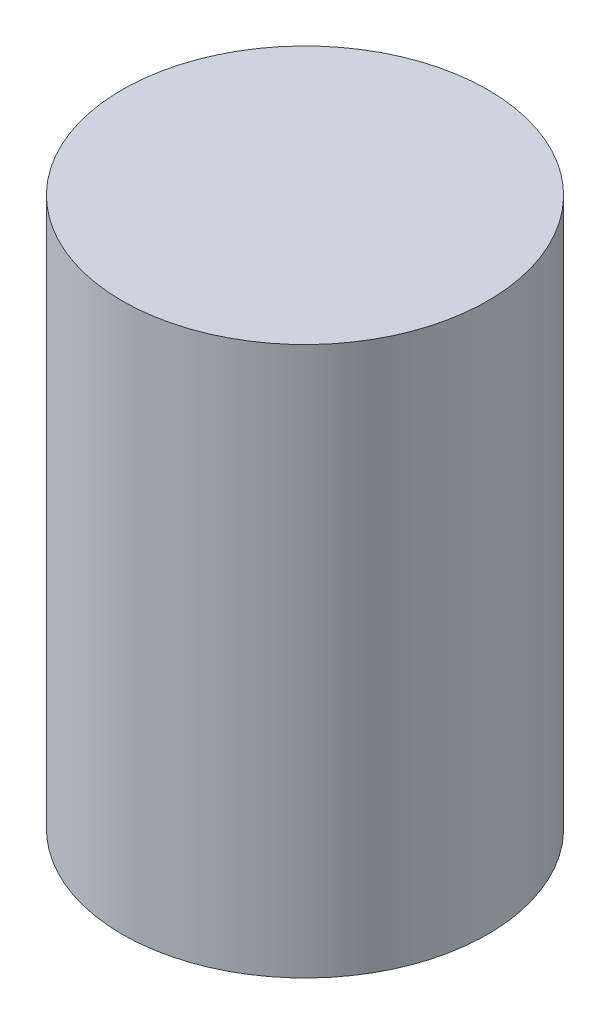
ISO-10303-21;
HEADER;
FILE_DESCRIPTION(('STEP AP214'),'2;1');
FILE_NAME('part.step','',(''),(''),'','','');
FILE_SCHEMA(('AUTOMOTIVE_DESIGN { 1 0 10303 214 1 1 1 1 }'));
ENDSEC;
DATA;
#1=APPLICATION_CONTEXT('core data for automotive mechanical design processes');
#2=APPLICATION_PROTOCOL_DEFINITION('international standard','automotive_design',2000,#1);
#3=PRODUCT_CONTEXT('',#1,'mechanical');
#4=PRODUCT('Part','Part','',(#3));
#5=PRODUCT_RELATED_PRODUCT_CATEGORY('part','',(#4));
#6=PRODUCT_DEFINITION_FORMATION('','',#4);
#7=PRODUCT_DEFINITION_CONTEXT('part definition',#1,'design');
#8=PRODUCT_DEFINITION('design','',#6,#7);
#9=PRODUCT_DEFINITION_SHAPE('','',#8);
#10=(LENGTH_UNIT() NAMED_UNIT(*) SI_UNIT(.MILLI.,.METRE.));
#11=(NAMED_UNIT(*) PLANE_ANGLE_UNIT() SI_UNIT($,.RADIAN.));
#12=(NAMED_UNIT(*) SI_UNIT($,.STERADIAN.) SOLID_ANGLE_UNIT());
#13=UNCERTAINTY_MEASURE_WITH_UNIT(LENGTH_MEASURE(1.E-05),#10,'distance_accuracy_value','');
#14=(GEOMETRIC_REPRESENTATION_CONTEXT(3) GLOBAL_UNCERTAINTY_ASSIGNED_CONTEXT((#13)) GLOBAL_UNIT_ASSIGNED_CONTEXT((#10,
#11,#12)) REPRESENTATION_CONTEXT('',''));
#15=CARTESIAN_POINT('',(0.,0.,0.));
#16=DIRECTION('',(0.,0.,1.));
#17=DIRECTION('',(1.,0.,0.));
#18=AXIS2_PLACEMENT_3D('',#15,#16,#17);
#19=CARTESIAN_POINT('',(0.,30.,0.));
#20=DIRECTION('',(0.,-1.,0.));
#21=DIRECTION('',(0.,0.,-1.));
#22=AXIS2_PLACEMENT_3D('',#19,#20,#21);
#23=CYLINDRICAL_SURFACE('',#22,10.);
#24=CARTESIAN_POINT('',(0.,30.,0.));
#25=DIRECTION('',(0.,1.,0.));
#26=DIRECTION('',(0.,0.,1.));
#27=AXIS2_PLACEMENT_3D('',#24,#25,#26);
#28=CIRCLE('',#27,10.);
#29=CARTESIAN_POINT('',(0.,30.,10.));
#30=VERTEX_POINT('',#29);
#31=EDGE_CURVE('E10',#30,#30,#28,.T.);
#32=ORIENTED_EDGE('',*,*,#31,.F.);
#33=EDGE_LOOP('',(#32));
#34=FACE_BOUND('',#33,.T.);
#35=CARTESIAN_POINT('',(0.,0.,0.));
#36=DIRECTION('',(0.,1.,0.));
#37=DIRECTION('',(0.,0.,1.));
#38=AXIS2_PLACEMENT_3D('',#35,#36,#37);
#39=CIRCLE('',#38,10.);
#40=CARTESIAN_POINT('',(0.,0.,10.));
#41=VERTEX_POINT('',#40);
#42=EDGE_CURVE('E34',#41,#41,#39,.T.);
#43=ORIENTED_EDGE('',*,*,#42,.T.);
#44=EDGE_LOOP('',(#43));
#45=FACE_BOUND('',#44,.T.);
#46=ADVANCED_FACE('F31',(#34,#45),#23,.T.);
#47=CARTESIAN_POINT('',(0.,30.,0.));
#48=DIRECTION('',(0.,1.,0.));
#49=DIRECTION('',(0.,0.,1.));
#50=AXIS2_PLACEMENT_3D('',#47,#48,#49);
#51=PLANE('',#50);
#52=ORIENTED_EDGE('',*,*,#31,.T.);
#53=EDGE_LOOP('',(#52));
#54=FACE_BOUND('',#53,.T.);
#55=ADVANCED_FACE('F46',(#54),#51,.T.);
#56=CARTESIAN_POINT('',(0.,0.,0.));
#57=DIRECTION('',(0.,1.,0.));
#58=DIRECTION('',(0.,0.,1.));
#59=AXIS2_PLACEMENT_3D('',#56,#57,#58);
#60=PLANE('',#59);
#61=ORIENTED_EDGE('',*,*,#42,.F.);
#62=EDGE_LOOP('',(#61));
#63=FACE_BOUND('',#62,.T.);
#64=ADVANCED_FACE('F44',(#63),#60,.F.);
#65=CLOSED_SHELL('',(#46,#55,#64));
#66=MANIFOLD_SOLID_BREP('B2',#65);
#67=ADVANCED_BREP_SHAPE_REPRESENTATION('',(#18,#66),#14);
#68=SHAPE_DEFINITION_REPRESENTATION(#9,#67);
ENDSEC;
END-ISO-10303-21;
